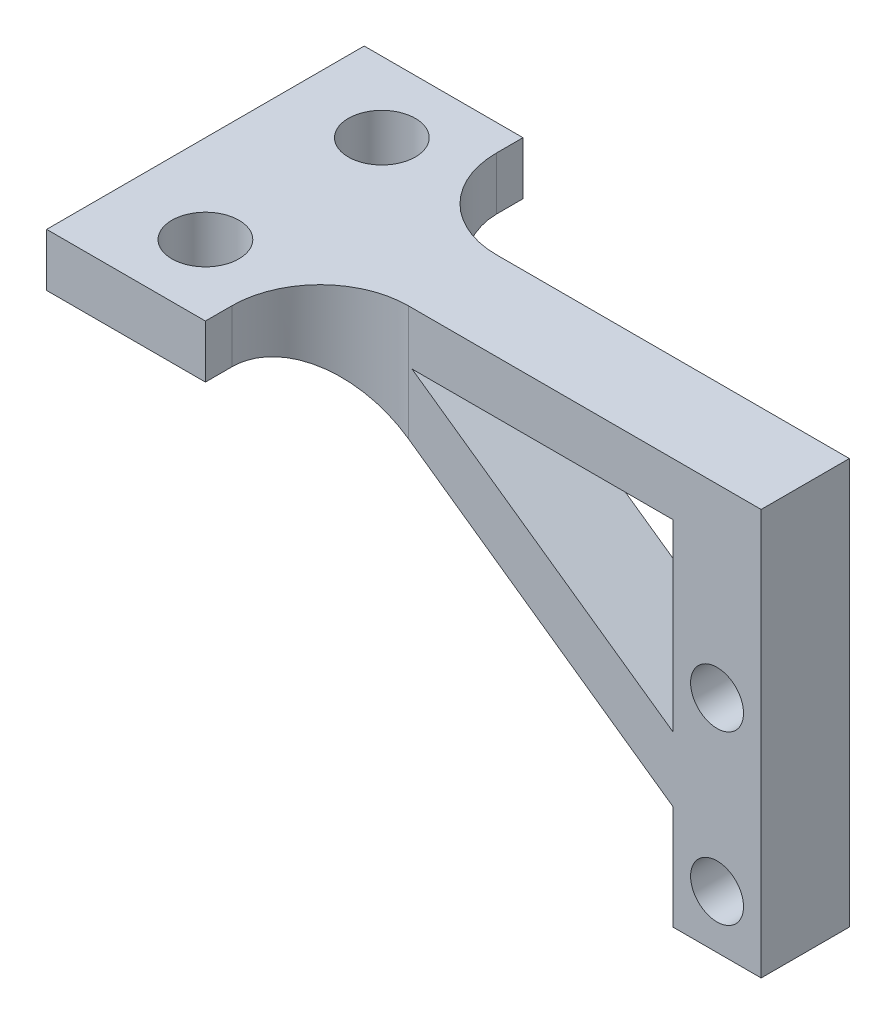
ISO-10303-21;
HEADER;
FILE_DESCRIPTION(('STEP AP214'),'2;1');
FILE_NAME('part.step','',(''),(''),'','','');
FILE_SCHEMA(('AUTOMOTIVE_DESIGN { 1 0 10303 214 1 1 1 1 }'));
ENDSEC;
DATA;
#1=APPLICATION_CONTEXT('core data for automotive mechanical design processes');
#2=APPLICATION_PROTOCOL_DEFINITION('international standard','automotive_design',2000,#1);
#3=PRODUCT_CONTEXT('',#1,'mechanical');
#4=PRODUCT('Part','Part','',(#3));
#5=PRODUCT_RELATED_PRODUCT_CATEGORY('part','',(#4));
#6=PRODUCT_DEFINITION_FORMATION('','',#4);
#7=PRODUCT_DEFINITION_CONTEXT('part definition',#1,'design');
#8=PRODUCT_DEFINITION('design','',#6,#7);
#9=PRODUCT_DEFINITION_SHAPE('','',#8);
#10=(LENGTH_UNIT() NAMED_UNIT(*) SI_UNIT(.MILLI.,.METRE.));
#11=(NAMED_UNIT(*) PLANE_ANGLE_UNIT() SI_UNIT($,.RADIAN.));
#12=(NAMED_UNIT(*) SI_UNIT($,.STERADIAN.) SOLID_ANGLE_UNIT());
#13=UNCERTAINTY_MEASURE_WITH_UNIT(LENGTH_MEASURE(1.E-05),#10,'distance_accuracy_value','');
#14=(GEOMETRIC_REPRESENTATION_CONTEXT(3) GLOBAL_UNCERTAINTY_ASSIGNED_CONTEXT((#13)) GLOBAL_UNIT_ASSIGNED_CONTEXT((#10,
#11,#12)) REPRESENTATION_CONTEXT('',''));
#15=CARTESIAN_POINT('',(0.,0.,0.));
#16=DIRECTION('',(0.,0.,1.));
#17=DIRECTION('',(1.,0.,0.));
#18=AXIS2_PLACEMENT_3D('',#15,#16,#17);
#19=CARTESIAN_POINT('',(0.,0.,0.));
#20=DIRECTION('',(0.,-1.,0.));
#21=DIRECTION('',(0.,0.,-1.));
#22=AXIS2_PLACEMENT_3D('',#19,#20,#21);
#23=PLANE('',#22);
#24=DIRECTION('',(-1.,0.,0.));
#25=VECTOR('',#24,1.);
#26=CARTESIAN_POINT('',(29.,0.,-2.5));
#27=LINE('',#26,#25);
#28=CARTESIAN_POINT('',(24.,0.,-2.5));
#29=VERTEX_POINT('',#28);
#30=CARTESIAN_POINT('',(9.21030531511632,0.,-2.5));
#31=VERTEX_POINT('',#30);
#32=EDGE_CURVE('E251',#29,#31,#27,.T.);
#33=ORIENTED_EDGE('',*,*,#32,.T.);
#34=DIRECTION('',(0.,0.,1.));
#35=VECTOR('',#34,1.);
#36=CARTESIAN_POINT('',(9.21030531511632,0.,-31.9617419759106));
#37=LINE('',#36,#35);
#38=CARTESIAN_POINT('',(9.21030531511632,0.,-7.5));
#39=VERTEX_POINT('',#38);
#40=EDGE_CURVE('E112',#39,#31,#37,.T.);
#41=ORIENTED_EDGE('',*,*,#40,.F.);
#42=DIRECTION('',(-1.,0.,0.));
#43=VECTOR('',#42,1.);
#44=CARTESIAN_POINT('',(29.,0.,-7.50000000000001));
#45=LINE('',#44,#43);
#46=CARTESIAN_POINT('',(24.,0.,-7.50000000000001));
#47=VERTEX_POINT('',#46);
#48=EDGE_CURVE('E248',#47,#39,#45,.T.);
#49=ORIENTED_EDGE('',*,*,#48,.F.);
#50=DIRECTION('',(0.,0.,-1.));
#51=VECTOR('',#50,1.);
#52=CARTESIAN_POINT('',(24.,0.,-2.5));
#53=LINE('',#52,#51);
#54=EDGE_CURVE('E279',#29,#47,#53,.T.);
#55=ORIENTED_EDGE('',*,*,#54,.F.);
#56=EDGE_LOOP('',(#33,#41,#49,#55));
#57=FACE_BOUND('',#56,.T.);
#58=ADVANCED_FACE('F33',(#57),#23,.T.);
#59=CARTESIAN_POINT('',(0.,0.,-10.));
#60=DIRECTION('',(0.,1.,0.));
#61=DIRECTION('',(0.,0.,1.));
#62=AXIS2_PLACEMENT_3D('',#59,#60,#61);
#63=CIRCLE('',#62,1.9);
#64=CARTESIAN_POINT('',(0.,0.,-8.1));
#65=VERTEX_POINT('',#64);
#66=EDGE_CURVE('E183',#65,#65,#63,.T.);
#67=ORIENTED_EDGE('',*,*,#66,.T.);
#68=EDGE_LOOP('',(#67));
#69=FACE_BOUND('',#68,.T.);
#70=CARTESIAN_POINT('',(0.,0.,0.));
#71=DIRECTION('',(0.,1.,0.));
#72=DIRECTION('',(0.,0.,1.));
#73=AXIS2_PLACEMENT_3D('',#70,#71,#72);
#74=CIRCLE('',#73,1.9);
#75=CARTESIAN_POINT('',(0.,0.,1.9));
#76=VERTEX_POINT('',#75);
#77=EDGE_CURVE('E175',#76,#76,#74,.T.);
#78=ORIENTED_EDGE('',*,*,#77,.T.);
#79=EDGE_LOOP('',(#78));
#80=FACE_BOUND('',#79,.T.);
#81=DIRECTION('',(0.,0.,-1.));
#82=VECTOR('',#81,1.);
#83=CARTESIAN_POINT('',(4.,0.,4.));
#84=LINE('',#83,#82);
#85=CARTESIAN_POINT('',(4.,0.,-12.5));
#86=VERTEX_POINT('',#85);
#87=CARTESIAN_POINT('',(4.,0.,-14.));
#88=VERTEX_POINT('',#87);
#89=EDGE_CURVE('E134',#86,#88,#84,.T.);
#90=ORIENTED_EDGE('',*,*,#89,.F.);
#91=DIRECTION('',(0.,0.,1.));
#92=VECTOR('',#91,1.);
#93=CARTESIAN_POINT('',(4.,0.,-31.9617419759106));
#94=LINE('',#93,#92);
#95=CARTESIAN_POINT('',(4.,0.,2.5));
#96=VERTEX_POINT('',#95);
#97=EDGE_CURVE('E48',#86,#96,#94,.T.);
#98=ORIENTED_EDGE('',*,*,#97,.T.);
#99=CARTESIAN_POINT('',(4.,0.,4.));
#100=VERTEX_POINT('',#99);
#101=EDGE_CURVE('E137',#100,#96,#84,.T.);
#102=ORIENTED_EDGE('',*,*,#101,.F.);
#103=DIRECTION('',(1.,0.,0.));
#104=VECTOR('',#103,1.);
#105=CARTESIAN_POINT('',(-5.,0.,4.));
#106=LINE('',#105,#104);
#107=CARTESIAN_POINT('',(-5.,0.,4.));
#108=VERTEX_POINT('',#107);
#109=EDGE_CURVE('E138',#108,#100,#106,.T.);
#110=ORIENTED_EDGE('',*,*,#109,.F.);
#111=DIRECTION('',(0.,0.,1.));
#112=VECTOR('',#111,1.);
#113=CARTESIAN_POINT('',(-5.,0.,4.));
#114=LINE('',#113,#112);
#115=CARTESIAN_POINT('',(-5.,0.,-14.));
#116=VERTEX_POINT('',#115);
#117=EDGE_CURVE('E165',#116,#108,#114,.T.);
#118=ORIENTED_EDGE('',*,*,#117,.F.);
#119=DIRECTION('',(-1.,0.,0.));
#120=VECTOR('',#119,1.);
#121=CARTESIAN_POINT('',(-5.,0.,-14.));
#122=LINE('',#121,#120);
#123=EDGE_CURVE('E145',#88,#116,#122,.T.);
#124=ORIENTED_EDGE('',*,*,#123,.F.);
#125=EDGE_LOOP('',(#90,#98,#102,#110,#118,#124));
#126=FACE_BOUND('',#125,.T.);
#127=ADVANCED_FACE('F206',(#69,#80,#126),#23,.T.);
#128=CARTESIAN_POINT('',(24.,-20.,-2.5));
#129=DIRECTION('',(1.,0.,0.));
#130=DIRECTION('',(0.,0.,-1.));
#131=AXIS2_PLACEMENT_3D('',#128,#129,#130);
#132=PLANE('',#131);
#133=DIRECTION('',(0.,0.,1.));
#134=VECTOR('',#133,1.);
#135=CARTESIAN_POINT('',(24.,-10.4153693518067,-31.9617419759106));
#136=LINE('',#135,#134);
#137=CARTESIAN_POINT('',(24.,-10.4153693518067,-7.50000000000001));
#138=VERTEX_POINT('',#137);
#139=CARTESIAN_POINT('',(24.,-10.4153693518067,-2.50000000000001));
#140=VERTEX_POINT('',#139);
#141=EDGE_CURVE('E108',#138,#140,#136,.T.);
#142=ORIENTED_EDGE('',*,*,#141,.T.);
#143=DIRECTION('',(0.,1.,0.));
#144=VECTOR('',#143,1.);
#145=CARTESIAN_POINT('',(24.,-20.,-2.5));
#146=LINE('',#145,#144);
#147=EDGE_CURVE('E298',#140,#29,#146,.T.);
#148=ORIENTED_EDGE('',*,*,#147,.T.);
#149=ORIENTED_EDGE('',*,*,#54,.T.);
#150=DIRECTION('',(0.,1.,0.));
#151=VECTOR('',#150,1.);
#152=CARTESIAN_POINT('',(24.,-20.,-7.50000000000001));
#153=LINE('',#152,#151);
#154=EDGE_CURVE('E261',#138,#47,#153,.T.);
#155=ORIENTED_EDGE('',*,*,#154,.F.);
#156=EDGE_LOOP('',(#142,#148,#149,#155));
#157=FACE_BOUND('',#156,.T.);
#158=ADVANCED_FACE('F337',(#157),#132,.F.);
#159=DIRECTION('',(0.,0.,1.));
#160=VECTOR('',#159,1.);
#161=CARTESIAN_POINT('',(24.,-14.0846306481933,-31.9617419759106));
#162=LINE('',#161,#160);
#163=CARTESIAN_POINT('',(24.,-14.0846306481933,-7.50000000000001));
#164=VERTEX_POINT('',#163);
#165=CARTESIAN_POINT('',(24.,-14.0846306481933,-2.5));
#166=VERTEX_POINT('',#165);
#167=EDGE_CURVE('E107',#164,#166,#162,.T.);
#168=ORIENTED_EDGE('',*,*,#167,.F.);
#169=CARTESIAN_POINT('',(24.,-20.,-7.50000000000001));
#170=VERTEX_POINT('',#169);
#171=EDGE_CURVE('E295',#170,#164,#153,.T.);
#172=ORIENTED_EDGE('',*,*,#171,.F.);
#173=DIRECTION('',(0.,0.,-1.));
#174=VECTOR('',#173,1.);
#175=CARTESIAN_POINT('',(24.,-20.,-2.5));
#176=LINE('',#175,#174);
#177=CARTESIAN_POINT('',(24.,-20.,-2.5));
#178=VERTEX_POINT('',#177);
#179=EDGE_CURVE('E282',#178,#170,#176,.T.);
#180=ORIENTED_EDGE('',*,*,#179,.F.);
#181=EDGE_CURVE('E301',#178,#166,#146,.T.);
#182=ORIENTED_EDGE('',*,*,#181,.T.);
#183=EDGE_LOOP('',(#168,#172,#180,#182));
#184=FACE_BOUND('',#183,.T.);
#185=ADVANCED_FACE('F349',(#184),#132,.F.);
#186=CARTESIAN_POINT('',(4.,3.,4.));
#187=DIRECTION('',(-1.,0.,0.));
#188=DIRECTION('',(0.,0.,1.));
#189=AXIS2_PLACEMENT_3D('',#186,#187,#188);
#190=PLANE('',#189);
#191=DIRECTION('',(0.,0.,-1.));
#192=VECTOR('',#191,1.);
#193=CARTESIAN_POINT('',(4.,3.,4.));
#194=LINE('',#193,#192);
#195=CARTESIAN_POINT('',(4.,3.,-12.5));
#196=VERTEX_POINT('',#195);
#197=CARTESIAN_POINT('',(4.,3.,-14.));
#198=VERTEX_POINT('',#197);
#199=EDGE_CURVE('E139',#196,#198,#194,.T.);
#200=ORIENTED_EDGE('',*,*,#199,.F.);
#201=DIRECTION('',(0.,1.,0.));
#202=VECTOR('',#201,1.);
#203=CARTESIAN_POINT('',(4.,0.,-12.5));
#204=LINE('',#203,#202);
#205=EDGE_CURVE('E101',#196,#86,#204,.F.);
#206=ORIENTED_EDGE('',*,*,#205,.T.);
#207=ORIENTED_EDGE('',*,*,#89,.T.);
#208=DIRECTION('',(0.,-1.,0.));
#209=VECTOR('',#208,1.);
#210=CARTESIAN_POINT('',(4.,3.,-14.));
#211=LINE('',#210,#209);
#212=EDGE_CURVE('E202',#198,#88,#211,.T.);
#213=ORIENTED_EDGE('',*,*,#212,.F.);
#214=EDGE_LOOP('',(#200,#206,#207,#213));
#215=FACE_BOUND('',#214,.T.);
#216=ADVANCED_FACE('F346',(#215),#190,.F.);
#217=ORIENTED_EDGE('',*,*,#101,.T.);
#218=DIRECTION('',(0.,-1.,0.));
#219=VECTOR('',#218,1.);
#220=CARTESIAN_POINT('',(4.,3.,2.5));
#221=LINE('',#220,#219);
#222=CARTESIAN_POINT('',(4.,3.,2.5));
#223=VERTEX_POINT('',#222);
#224=EDGE_CURVE('E56',#96,#223,#221,.F.);
#225=ORIENTED_EDGE('',*,*,#224,.T.);
#226=CARTESIAN_POINT('',(4.,3.,4.));
#227=VERTEX_POINT('',#226);
#228=EDGE_CURVE('E152',#227,#223,#194,.T.);
#229=ORIENTED_EDGE('',*,*,#228,.F.);
#230=DIRECTION('',(0.,-1.,0.));
#231=VECTOR('',#230,1.);
#232=CARTESIAN_POINT('',(4.,3.,4.));
#233=LINE('',#232,#231);
#234=EDGE_CURVE('E216',#227,#100,#233,.T.);
#235=ORIENTED_EDGE('',*,*,#234,.T.);
#236=EDGE_LOOP('',(#217,#225,#229,#235));
#237=FACE_BOUND('',#236,.T.);
#238=ADVANCED_FACE('F218',(#237),#190,.F.);
#239=CARTESIAN_POINT('',(0.,3.,0.));
#240=DIRECTION('',(0.,-1.,0.));
#241=DIRECTION('',(0.,0.,-1.));
#242=AXIS2_PLACEMENT_3D('',#239,#240,#241);
#243=PLANE('',#242);
#244=CARTESIAN_POINT('',(0.,3.,0.));
#245=DIRECTION('',(0.,1.,0.));
#246=DIRECTION('',(0.,0.,1.));
#247=AXIS2_PLACEMENT_3D('',#244,#245,#246);
#248=CIRCLE('',#247,1.9);
#249=CARTESIAN_POINT('',(0.,3.,1.9));
#250=VERTEX_POINT('',#249);
#251=EDGE_CURVE('E167',#250,#250,#248,.T.);
#252=ORIENTED_EDGE('',*,*,#251,.F.);
#253=EDGE_LOOP('',(#252));
#254=FACE_BOUND('',#253,.T.);
#255=DIRECTION('',(0.,0.,1.));
#256=VECTOR('',#255,1.);
#257=CARTESIAN_POINT('',(-5.,3.,4.));
#258=LINE('',#257,#256);
#259=CARTESIAN_POINT('',(-5.,3.,-14.));
#260=VERTEX_POINT('',#259);
#261=CARTESIAN_POINT('',(-5.,3.,4.));
#262=VERTEX_POINT('',#261);
#263=EDGE_CURVE('E185',#260,#262,#258,.T.);
#264=ORIENTED_EDGE('',*,*,#263,.T.);
#265=DIRECTION('',(1.,0.,0.));
#266=VECTOR('',#265,1.);
#267=CARTESIAN_POINT('',(-5.,3.,4.));
#268=LINE('',#267,#266);
#269=EDGE_CURVE('E160',#262,#227,#268,.T.);
#270=ORIENTED_EDGE('',*,*,#269,.T.);
#271=ORIENTED_EDGE('',*,*,#228,.T.);
#272=CARTESIAN_POINT('',(9.,3.,2.5));
#273=DIRECTION('',(0.,-1.,0.));
#274=DIRECTION('',(0.,0.,-1.));
#275=AXIS2_PLACEMENT_3D('',#272,#273,#274);
#276=CIRCLE('',#275,5.);
#277=CARTESIAN_POINT('',(9.,3.,-2.5));
#278=VERTEX_POINT('',#277);
#279=EDGE_CURVE('E11',#223,#278,#276,.T.);
#280=ORIENTED_EDGE('',*,*,#279,.T.);
#281=DIRECTION('',(-1.,0.,0.));
#282=VECTOR('',#281,1.);
#283=CARTESIAN_POINT('',(29.,3.,-2.5));
#284=LINE('',#283,#282);
#285=CARTESIAN_POINT('',(29.,3.,-2.5));
#286=VERTEX_POINT('',#285);
#287=EDGE_CURVE('E100',#286,#278,#284,.T.);
#288=ORIENTED_EDGE('',*,*,#287,.F.);
#289=DIRECTION('',(0.,0.,1.));
#290=VECTOR('',#289,1.);
#291=CARTESIAN_POINT('',(29.,3.,-7.50000000000001));
#292=LINE('',#291,#290);
#293=CARTESIAN_POINT('',(29.,3.,-7.50000000000001));
#294=VERTEX_POINT('',#293);
#295=EDGE_CURVE('E373',#294,#286,#292,.T.);
#296=ORIENTED_EDGE('',*,*,#295,.F.);
#297=DIRECTION('',(-1.,0.,0.));
#298=VECTOR('',#297,1.);
#299=CARTESIAN_POINT('',(29.,3.,-7.50000000000001));
#300=LINE('',#299,#298);
#301=CARTESIAN_POINT('',(9.,3.,-7.5));
#302=VERTEX_POINT('',#301);
#303=EDGE_CURVE('E370',#294,#302,#300,.T.);
#304=ORIENTED_EDGE('',*,*,#303,.T.);
#305=CARTESIAN_POINT('',(9.,3.,-12.5));
#306=DIRECTION('',(0.,-1.,0.));
#307=DIRECTION('',(0.,0.,-1.));
#308=AXIS2_PLACEMENT_3D('',#305,#306,#307);
#309=CIRCLE('',#308,5.);
#310=EDGE_CURVE('E76',#302,#196,#309,.T.);
#311=ORIENTED_EDGE('',*,*,#310,.T.);
#312=ORIENTED_EDGE('',*,*,#199,.T.);
#313=DIRECTION('',(-1.,0.,0.));
#314=VECTOR('',#313,1.);
#315=CARTESIAN_POINT('',(-5.,3.,-14.));
#316=LINE('',#315,#314);
#317=EDGE_CURVE('E154',#198,#260,#316,.T.);
#318=ORIENTED_EDGE('',*,*,#317,.T.);
#319=EDGE_LOOP('',(#264,#270,#271,#280,#288,#296,#304,#311,#312,#318));
#320=FACE_BOUND('',#319,.T.);
#321=CARTESIAN_POINT('',(0.,3.,-10.));
#322=DIRECTION('',(0.,1.,0.));
#323=DIRECTION('',(0.,0.,1.));
#324=AXIS2_PLACEMENT_3D('',#321,#322,#323);
#325=CIRCLE('',#324,1.9);
#326=CARTESIAN_POINT('',(0.,3.,-8.1));
#327=VERTEX_POINT('',#326);
#328=EDGE_CURVE('E180',#327,#327,#325,.T.);
#329=ORIENTED_EDGE('',*,*,#328,.F.);
#330=EDGE_LOOP('',(#329));
#331=FACE_BOUND('',#330,.T.);
#332=ADVANCED_FACE('F341',(#254,#320,#331),#243,.F.);
#333=CARTESIAN_POINT('',(-5.,3.,4.));
#334=DIRECTION('',(1.,0.,0.));
#335=DIRECTION('',(0.,0.,-1.));
#336=AXIS2_PLACEMENT_3D('',#333,#334,#335);
#337=PLANE('',#336);
#338=ORIENTED_EDGE('',*,*,#117,.T.);
#339=DIRECTION('',(0.,-1.,0.));
#340=VECTOR('',#339,1.);
#341=CARTESIAN_POINT('',(-5.,3.,4.));
#342=LINE('',#341,#340);
#343=EDGE_CURVE('E133',#262,#108,#342,.T.);
#344=ORIENTED_EDGE('',*,*,#343,.F.);
#345=ORIENTED_EDGE('',*,*,#263,.F.);
#346=DIRECTION('',(0.,-1.,0.));
#347=VECTOR('',#346,1.);
#348=CARTESIAN_POINT('',(-5.,3.,-14.));
#349=LINE('',#348,#347);
#350=EDGE_CURVE('E164',#260,#116,#349,.T.);
#351=ORIENTED_EDGE('',*,*,#350,.T.);
#352=EDGE_LOOP('',(#338,#344,#345,#351));
#353=FACE_BOUND('',#352,.T.);
#354=ADVANCED_FACE('F204',(#353),#337,.F.);
#355=CARTESIAN_POINT('',(-5.,3.,4.));
#356=DIRECTION('',(0.,0.,-1.));
#357=DIRECTION('',(-1.,0.,0.));
#358=AXIS2_PLACEMENT_3D('',#355,#356,#357);
#359=PLANE('',#358);
#360=ORIENTED_EDGE('',*,*,#109,.T.);
#361=ORIENTED_EDGE('',*,*,#234,.F.);
#362=ORIENTED_EDGE('',*,*,#269,.F.);
#363=ORIENTED_EDGE('',*,*,#343,.T.);
#364=EDGE_LOOP('',(#360,#361,#362,#363));
#365=FACE_BOUND('',#364,.T.);
#366=ADVANCED_FACE('F215',(#365),#359,.F.);
#367=CARTESIAN_POINT('',(-5.,3.,-14.));
#368=DIRECTION('',(0.,0.,1.));
#369=DIRECTION('',(1.,0.,0.));
#370=AXIS2_PLACEMENT_3D('',#367,#368,#369);
#371=PLANE('',#370);
#372=ORIENTED_EDGE('',*,*,#123,.T.);
#373=ORIENTED_EDGE('',*,*,#350,.F.);
#374=ORIENTED_EDGE('',*,*,#317,.F.);
#375=ORIENTED_EDGE('',*,*,#212,.T.);
#376=EDGE_LOOP('',(#372,#373,#374,#375));
#377=FACE_BOUND('',#376,.T.);
#378=ADVANCED_FACE('F197',(#377),#371,.F.);
#379=CARTESIAN_POINT('',(0.,3.,0.));
#380=DIRECTION('',(0.,-1.,0.));
#381=DIRECTION('',(0.,0.,-1.));
#382=AXIS2_PLACEMENT_3D('',#379,#380,#381);
#383=CYLINDRICAL_SURFACE('',#382,1.9);
#384=ORIENTED_EDGE('',*,*,#251,.T.);
#385=EDGE_LOOP('',(#384));
#386=FACE_BOUND('',#385,.T.);
#387=ORIENTED_EDGE('',*,*,#77,.F.);
#388=EDGE_LOOP('',(#387));
#389=FACE_BOUND('',#388,.T.);
#390=ADVANCED_FACE('F345',(#386,#389),#383,.F.);
#391=CARTESIAN_POINT('',(0.,3.,-10.));
#392=DIRECTION('',(0.,-1.,0.));
#393=DIRECTION('',(0.,0.,-1.));
#394=AXIS2_PLACEMENT_3D('',#391,#392,#393);
#395=CYLINDRICAL_SURFACE('',#394,1.9);
#396=ORIENTED_EDGE('',*,*,#328,.T.);
#397=EDGE_LOOP('',(#396));
#398=FACE_BOUND('',#397,.T.);
#399=ORIENTED_EDGE('',*,*,#66,.F.);
#400=EDGE_LOOP('',(#399));
#401=FACE_BOUND('',#400,.T.);
#402=ADVANCED_FACE('F422',(#398,#401),#395,.F.);
#403=CARTESIAN_POINT('',(29.,0.,-7.50000000000001));
#404=DIRECTION('',(0.,0.,1.));
#405=DIRECTION('',(1.,0.,0.));
#406=AXIS2_PLACEMENT_3D('',#403,#404,#405);
#407=PLANE('',#406);
#408=DIRECTION('',(0.81760326062206,-0.575781997131012,0.));
#409=VECTOR('',#408,1.);
#410=CARTESIAN_POINT('',(24.,-14.0846306481933,-7.5));
#411=LINE('',#410,#409);
#412=CARTESIAN_POINT('',(9.,-3.52115766204832,-7.5));
#413=VERTEX_POINT('',#412);
#414=EDGE_CURVE('E127',#413,#164,#411,.T.);
#415=ORIENTED_EDGE('',*,*,#414,.F.);
#416=DIRECTION('',(0.,1.,0.));
#417=VECTOR('',#416,1.);
#418=CARTESIAN_POINT('',(9.,3.,-7.5));
#419=LINE('',#418,#417);
#420=EDGE_CURVE('E131',#413,#302,#419,.T.);
#421=ORIENTED_EDGE('',*,*,#420,.T.);
#422=ORIENTED_EDGE('',*,*,#303,.F.);
#423=DIRECTION('',(0.,1.,0.));
#424=VECTOR('',#423,1.);
#425=CARTESIAN_POINT('',(29.,0.,-7.50000000000001));
#426=LINE('',#425,#424);
#427=CARTESIAN_POINT('',(29.,-20.,-7.50000000000001));
#428=VERTEX_POINT('',#427);
#429=EDGE_CURVE('E290',#428,#294,#426,.T.);
#430=ORIENTED_EDGE('',*,*,#429,.F.);
#431=DIRECTION('',(1.,0.,0.));
#432=VECTOR('',#431,1.);
#433=CARTESIAN_POINT('',(29.,-20.,-7.50000000000001));
#434=LINE('',#433,#432);
#435=EDGE_CURVE('E285',#170,#428,#434,.T.);
#436=ORIENTED_EDGE('',*,*,#435,.F.);
#437=ORIENTED_EDGE('',*,*,#171,.T.);
#438=EDGE_LOOP('',(#415,#421,#422,#430,#436,#437));
#439=FACE_BOUND('',#438,.T.);
#440=CARTESIAN_POINT('',(26.5,-7.5,-7.50000000000001));
#441=DIRECTION('',(0.,0.,-1.));
#442=DIRECTION('',(-1.,0.,0.));
#443=AXIS2_PLACEMENT_3D('',#440,#441,#442);
#444=CIRCLE('',#443,1.5);
#445=CARTESIAN_POINT('',(25.,-7.5,-7.50000000000001));
#446=VERTEX_POINT('',#445);
#447=EDGE_CURVE('E129',#446,#446,#444,.T.);
#448=ORIENTED_EDGE('',*,*,#447,.F.);
#449=EDGE_LOOP('',(#448));
#450=FACE_BOUND('',#449,.T.);
#451=CARTESIAN_POINT('',(26.5,-17.,-7.50000000000001));
#452=DIRECTION('',(0.,0.,-1.));
#453=DIRECTION('',(-1.,0.,0.));
#454=AXIS2_PLACEMENT_3D('',#451,#452,#453);
#455=CIRCLE('',#454,1.5);
#456=CARTESIAN_POINT('',(25.,-17.,-7.50000000000001));
#457=VERTEX_POINT('',#456);
#458=EDGE_CURVE('E271',#457,#457,#455,.T.);
#459=ORIENTED_EDGE('',*,*,#458,.F.);
#460=EDGE_LOOP('',(#459));
#461=FACE_BOUND('',#460,.T.);
#462=ORIENTED_EDGE('',*,*,#48,.T.);
#463=DIRECTION('',(-0.81760326062206,0.575781997131012,0.));
#464=VECTOR('',#463,1.);
#465=CARTESIAN_POINT('',(24.,-10.4153693518067,-7.50000000000001));
#466=LINE('',#465,#464);
#467=EDGE_CURVE('E130',#138,#39,#466,.T.);
#468=ORIENTED_EDGE('',*,*,#467,.F.);
#469=ORIENTED_EDGE('',*,*,#154,.T.);
#470=EDGE_LOOP('',(#462,#468,#469));
#471=FACE_BOUND('',#470,.T.);
#472=ADVANCED_FACE('F259',(#439,#450,#461,#471),#407,.F.);
#473=CARTESIAN_POINT('',(29.,0.,-2.5));
#474=DIRECTION('',(0.,0.,-1.));
#475=DIRECTION('',(-1.,0.,0.));
#476=AXIS2_PLACEMENT_3D('',#473,#474,#475);
#477=PLANE('',#476);
#478=ORIENTED_EDGE('',*,*,#287,.T.);
#479=DIRECTION('',(0.,-1.,0.));
#480=VECTOR('',#479,1.);
#481=CARTESIAN_POINT('',(9.,0.,-2.5));
#482=LINE('',#481,#480);
#483=CARTESIAN_POINT('',(9.,-3.52115766204832,-2.50000000000001));
#484=VERTEX_POINT('',#483);
#485=EDGE_CURVE('E86',#278,#484,#482,.T.);
#486=ORIENTED_EDGE('',*,*,#485,.T.);
#487=DIRECTION('',(0.81760326062206,-0.575781997131012,0.));
#488=VECTOR('',#487,1.);
#489=CARTESIAN_POINT('',(24.,-14.0846306481933,-2.50000000000001));
#490=LINE('',#489,#488);
#491=EDGE_CURVE('E96',#484,#166,#490,.T.);
#492=ORIENTED_EDGE('',*,*,#491,.T.);
#493=ORIENTED_EDGE('',*,*,#181,.F.);
#494=DIRECTION('',(-1.,0.,0.));
#495=VECTOR('',#494,1.);
#496=CARTESIAN_POINT('',(29.,-20.,-2.5));
#497=LINE('',#496,#495);
#498=CARTESIAN_POINT('',(29.,-20.,-2.5));
#499=VERTEX_POINT('',#498);
#500=EDGE_CURVE('E278',#499,#178,#497,.T.);
#501=ORIENTED_EDGE('',*,*,#500,.F.);
#502=DIRECTION('',(0.,-1.,0.));
#503=VECTOR('',#502,1.);
#504=CARTESIAN_POINT('',(29.,0.,-2.5));
#505=LINE('',#504,#503);
#506=EDGE_CURVE('E262',#286,#499,#505,.T.);
#507=ORIENTED_EDGE('',*,*,#506,.F.);
#508=EDGE_LOOP('',(#478,#486,#492,#493,#501,#507));
#509=FACE_BOUND('',#508,.T.);
#510=CARTESIAN_POINT('',(26.5,-7.5,-2.5));
#511=DIRECTION('',(0.,0.,-1.));
#512=DIRECTION('',(-1.,0.,0.));
#513=AXIS2_PLACEMENT_3D('',#510,#511,#512);
#514=CIRCLE('',#513,1.5);
#515=CARTESIAN_POINT('',(25.,-7.5,-2.5));
#516=VERTEX_POINT('',#515);
#517=EDGE_CURVE('E270',#516,#516,#514,.T.);
#518=ORIENTED_EDGE('',*,*,#517,.T.);
#519=EDGE_LOOP('',(#518));
#520=FACE_BOUND('',#519,.T.);
#521=CARTESIAN_POINT('',(26.5,-17.,-2.5));
#522=DIRECTION('',(0.,0.,-1.));
#523=DIRECTION('',(-1.,0.,0.));
#524=AXIS2_PLACEMENT_3D('',#521,#522,#523);
#525=CIRCLE('',#524,1.5);
#526=CARTESIAN_POINT('',(25.,-17.,-2.5));
#527=VERTEX_POINT('',#526);
#528=EDGE_CURVE('E274',#527,#527,#525,.T.);
#529=ORIENTED_EDGE('',*,*,#528,.T.);
#530=EDGE_LOOP('',(#529));
#531=FACE_BOUND('',#530,.T.);
#532=DIRECTION('',(-0.81760326062206,0.575781997131012,0.));
#533=VECTOR('',#532,1.);
#534=CARTESIAN_POINT('',(24.,-10.4153693518067,-2.50000000000001));
#535=LINE('',#534,#533);
#536=EDGE_CURVE('E109',#140,#31,#535,.T.);
#537=ORIENTED_EDGE('',*,*,#536,.T.);
#538=ORIENTED_EDGE('',*,*,#32,.F.);
#539=ORIENTED_EDGE('',*,*,#147,.F.);
#540=EDGE_LOOP('',(#537,#538,#539));
#541=FACE_BOUND('',#540,.T.);
#542=ADVANCED_FACE('F92',(#509,#520,#531,#541),#477,.F.);
#543=CARTESIAN_POINT('',(29.,0.,0.));
#544=DIRECTION('',(1.,0.,0.));
#545=DIRECTION('',(0.,0.,-1.));
#546=AXIS2_PLACEMENT_3D('',#543,#544,#545);
#547=PLANE('',#546);
#548=ORIENTED_EDGE('',*,*,#429,.T.);
#549=ORIENTED_EDGE('',*,*,#295,.T.);
#550=ORIENTED_EDGE('',*,*,#506,.T.);
#551=DIRECTION('',(0.,0.,1.));
#552=VECTOR('',#551,1.);
#553=CARTESIAN_POINT('',(29.,-20.,-2.5));
#554=LINE('',#553,#552);
#555=EDGE_CURVE('E275',#428,#499,#554,.T.);
#556=ORIENTED_EDGE('',*,*,#555,.F.);
#557=EDGE_LOOP('',(#548,#549,#550,#556));
#558=FACE_BOUND('',#557,.T.);
#559=ADVANCED_FACE('F327',(#558),#547,.T.);
#560=CARTESIAN_POINT('',(0.,-20.,0.));
#561=DIRECTION('',(0.,1.,0.));
#562=DIRECTION('',(0.,0.,1.));
#563=AXIS2_PLACEMENT_3D('',#560,#561,#562);
#564=PLANE('',#563);
#565=ORIENTED_EDGE('',*,*,#555,.T.);
#566=ORIENTED_EDGE('',*,*,#500,.T.);
#567=ORIENTED_EDGE('',*,*,#179,.T.);
#568=ORIENTED_EDGE('',*,*,#435,.T.);
#569=EDGE_LOOP('',(#565,#566,#567,#568));
#570=FACE_BOUND('',#569,.T.);
#571=ADVANCED_FACE('F318',(#570),#564,.F.);
#572=CARTESIAN_POINT('',(26.5,-17.,12.5));
#573=DIRECTION('',(0.,0.,-1.));
#574=DIRECTION('',(-1.,0.,0.));
#575=AXIS2_PLACEMENT_3D('',#572,#573,#574);
#576=CYLINDRICAL_SURFACE('',#575,1.5);
#577=ORIENTED_EDGE('',*,*,#458,.T.);
#578=EDGE_LOOP('',(#577));
#579=FACE_BOUND('',#578,.T.);
#580=ORIENTED_EDGE('',*,*,#528,.F.);
#581=EDGE_LOOP('',(#580));
#582=FACE_BOUND('',#581,.T.);
#583=ADVANCED_FACE('F315',(#579,#582),#576,.F.);
#584=CARTESIAN_POINT('',(26.5,-7.5,12.5));
#585=DIRECTION('',(0.,0.,-1.));
#586=DIRECTION('',(-1.,0.,0.));
#587=AXIS2_PLACEMENT_3D('',#584,#585,#586);
#588=CYLINDRICAL_SURFACE('',#587,1.5);
#589=ORIENTED_EDGE('',*,*,#447,.T.);
#590=EDGE_LOOP('',(#589));
#591=FACE_BOUND('',#590,.T.);
#592=ORIENTED_EDGE('',*,*,#517,.F.);
#593=EDGE_LOOP('',(#592));
#594=FACE_BOUND('',#593,.T.);
#595=ADVANCED_FACE('F317',(#591,#594),#588,.F.);
#596=CARTESIAN_POINT('',(24.,-10.4153693518067,-31.9617419759106));
#597=DIRECTION('',(-0.575781997131012,-0.81760326062206,0.));
#598=DIRECTION('',(0.81760326062206,-0.575781997131012,0.));
#599=AXIS2_PLACEMENT_3D('',#596,#597,#598);
#600=PLANE('',#599);
#601=ORIENTED_EDGE('',*,*,#141,.F.);
#602=ORIENTED_EDGE('',*,*,#467,.T.);
#603=ORIENTED_EDGE('',*,*,#40,.T.);
#604=ORIENTED_EDGE('',*,*,#536,.F.);
#605=EDGE_LOOP('',(#601,#602,#603,#604));
#606=FACE_BOUND('',#605,.T.);
#607=ADVANCED_FACE('F264',(#606),#600,.F.);
#608=CARTESIAN_POINT('',(24.,-14.0846306481933,-31.9617419759106));
#609=DIRECTION('',(0.575781997131012,0.81760326062206,0.));
#610=DIRECTION('',(-0.81760326062206,0.575781997131012,0.));
#611=AXIS2_PLACEMENT_3D('',#608,#609,#610);
#612=PLANE('',#611);
#613=ORIENTED_EDGE('',*,*,#97,.F.);
#614=CARTESIAN_POINT('',(9.,-3.52115766204832,-12.5));
#615=DIRECTION('',(0.575781997131012,0.81760326062206,0.));
#616=DIRECTION('',(0.81760326062206,-0.575781997131012,0.));
#617=AXIS2_PLACEMENT_3D('',#614,#615,#616);
#618=ELLIPSE('',#617,6.11543549397765,5.);
#619=EDGE_CURVE('E88',#86,#413,#618,.T.);
#620=ORIENTED_EDGE('',*,*,#619,.T.);
#621=ORIENTED_EDGE('',*,*,#414,.T.);
#622=ORIENTED_EDGE('',*,*,#167,.T.);
#623=ORIENTED_EDGE('',*,*,#491,.F.);
#624=CARTESIAN_POINT('',(9.,-3.52115766204832,2.5));
#625=DIRECTION('',(0.575781997131012,0.81760326062206,0.));
#626=DIRECTION('',(-0.81760326062206,0.575781997131012,0.));
#627=AXIS2_PLACEMENT_3D('',#624,#625,#626);
#628=ELLIPSE('',#627,6.11543549397765,5.);
#629=EDGE_CURVE('E41',#484,#96,#628,.T.);
#630=ORIENTED_EDGE('',*,*,#629,.T.);
#631=EDGE_LOOP('',(#613,#620,#621,#622,#623,#630));
#632=FACE_BOUND('',#631,.T.);
#633=ADVANCED_FACE('F104',(#632),#612,.F.);
#634=CARTESIAN_POINT('',(9.,0.,-12.5));
#635=DIRECTION('',(0.,-1.,0.));
#636=DIRECTION('',(0.,0.,-1.));
#637=AXIS2_PLACEMENT_3D('',#634,#635,#636);
#638=CYLINDRICAL_SURFACE('',#637,5.);
#639=ORIENTED_EDGE('',*,*,#619,.F.);
#640=ORIENTED_EDGE('',*,*,#205,.F.);
#641=ORIENTED_EDGE('',*,*,#310,.F.);
#642=ORIENTED_EDGE('',*,*,#420,.F.);
#643=EDGE_LOOP('',(#639,#640,#641,#642));
#644=FACE_BOUND('',#643,.T.);
#645=ADVANCED_FACE('F354',(#644),#638,.F.);
#646=CARTESIAN_POINT('',(9.,0.,2.5));
#647=DIRECTION('',(0.,1.,0.));
#648=DIRECTION('',(0.,0.,1.));
#649=AXIS2_PLACEMENT_3D('',#646,#647,#648);
#650=CYLINDRICAL_SURFACE('',#649,5.);
#651=ORIENTED_EDGE('',*,*,#279,.F.);
#652=ORIENTED_EDGE('',*,*,#224,.F.);
#653=ORIENTED_EDGE('',*,*,#629,.F.);
#654=ORIENTED_EDGE('',*,*,#485,.F.);
#655=EDGE_LOOP('',(#651,#652,#653,#654));
#656=FACE_BOUND('',#655,.T.);
#657=ADVANCED_FACE('F35',(#656),#650,.F.);
#658=CLOSED_SHELL('',(#58,#127,#158,#185,#216,#238,#332,#354,#366,#378,#390,#402,#472,#542,#559,
#571,#583,#595,#607,#633,#645,#657));
#659=MANIFOLD_SOLID_BREP('B2',#658);
#660=ADVANCED_BREP_SHAPE_REPRESENTATION('',(#18,#659),#14);
#661=SHAPE_DEFINITION_REPRESENTATION(#9,#660);
ENDSEC;
END-ISO-10303-21;
